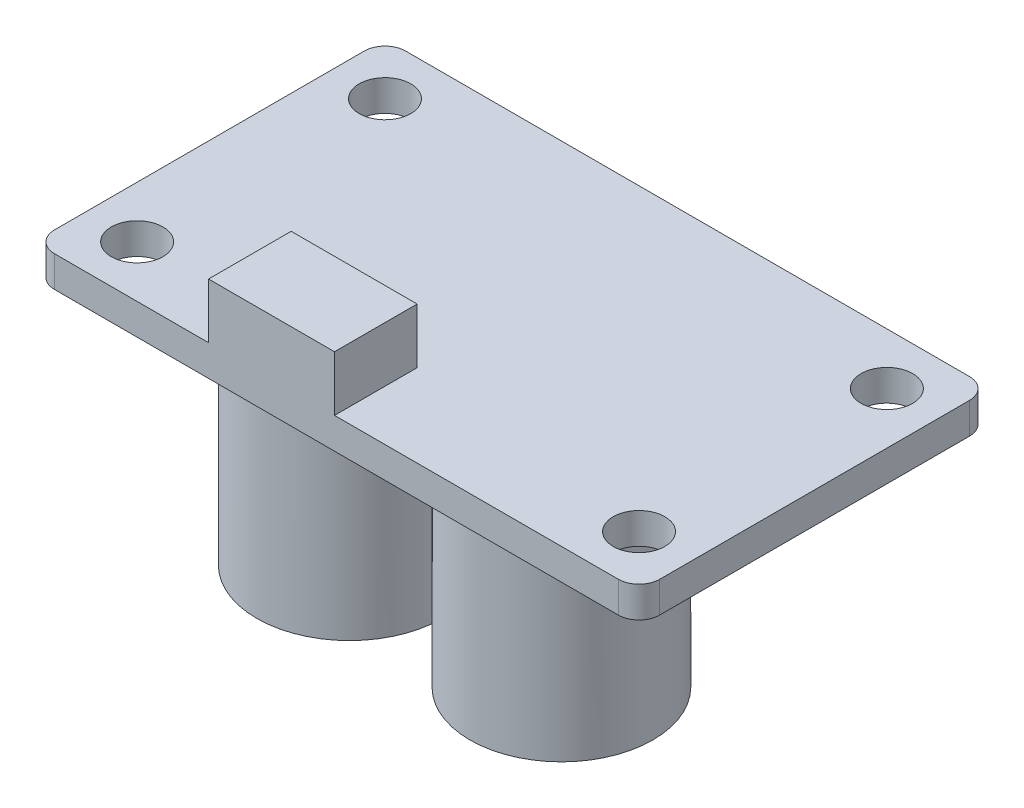
ISO-10303-21;
HEADER;
FILE_DESCRIPTION(('STEP AP214'),'2;1');
FILE_NAME('part.step','',(''),(''),'','','');
FILE_SCHEMA(('AUTOMOTIVE_DESIGN { 1 0 10303 214 1 1 1 1 }'));
ENDSEC;
DATA;
#1=APPLICATION_CONTEXT('core data for automotive mechanical design processes');
#2=APPLICATION_PROTOCOL_DEFINITION('international standard','automotive_design',2000,#1);
#3=PRODUCT_CONTEXT('',#1,'mechanical');
#4=PRODUCT('Part','Part','',(#3));
#5=PRODUCT_RELATED_PRODUCT_CATEGORY('part','',(#4));
#6=PRODUCT_DEFINITION_FORMATION('','',#4);
#7=PRODUCT_DEFINITION_CONTEXT('part definition',#1,'design');
#8=PRODUCT_DEFINITION('design','',#6,#7);
#9=PRODUCT_DEFINITION_SHAPE('','',#8);
#10=(LENGTH_UNIT() NAMED_UNIT(*) SI_UNIT(.MILLI.,.METRE.));
#11=(NAMED_UNIT(*) PLANE_ANGLE_UNIT() SI_UNIT($,.RADIAN.));
#12=(NAMED_UNIT(*) SI_UNIT($,.STERADIAN.) SOLID_ANGLE_UNIT());
#13=UNCERTAINTY_MEASURE_WITH_UNIT(LENGTH_MEASURE(1.E-05),#10,'distance_accuracy_value','');
#14=(GEOMETRIC_REPRESENTATION_CONTEXT(3) GLOBAL_UNCERTAINTY_ASSIGNED_CONTEXT((#13)) GLOBAL_UNIT_ASSIGNED_CONTEXT((#10,
#11,#12)) REPRESENTATION_CONTEXT('',''));
#15=CARTESIAN_POINT('',(0.,0.,0.));
#16=DIRECTION('',(0.,0.,1.));
#17=DIRECTION('',(1.,0.,0.));
#18=AXIS2_PLACEMENT_3D('',#15,#16,#17);
#19=CARTESIAN_POINT('',(14.65,1.5,-8.5));
#20=DIRECTION('',(-1.,0.,0.));
#21=DIRECTION('',(0.,0.,1.));
#22=AXIS2_PLACEMENT_3D('',#19,#20,#21);
#23=PLANE('',#22);
#24=DIRECTION('',(0.,0.,-1.));
#25=VECTOR('',#24,1.);
#26=CARTESIAN_POINT('',(14.65,0.,-8.5));
#27=LINE('',#26,#25);
#28=CARTESIAN_POINT('',(14.65,0.,7.5));
#29=VERTEX_POINT('',#28);
#30=CARTESIAN_POINT('',(14.65,0.,-7.5));
#31=VERTEX_POINT('',#30);
#32=EDGE_CURVE('E185',#29,#31,#27,.T.);
#33=ORIENTED_EDGE('',*,*,#32,.T.);
#34=DIRECTION('',(0.,-1.,0.));
#35=VECTOR('',#34,1.);
#36=CARTESIAN_POINT('',(14.65,1.5,-7.5));
#37=LINE('',#36,#35);
#38=CARTESIAN_POINT('',(14.65,1.5,-7.5));
#39=VERTEX_POINT('',#38);
#40=EDGE_CURVE('E232',#31,#39,#37,.F.);
#41=ORIENTED_EDGE('',*,*,#40,.T.);
#42=DIRECTION('',(0.,0.,-1.));
#43=VECTOR('',#42,1.);
#44=CARTESIAN_POINT('',(14.65,1.5,-8.5));
#45=LINE('',#44,#43);
#46=CARTESIAN_POINT('',(14.65,1.5,7.5));
#47=VERTEX_POINT('',#46);
#48=EDGE_CURVE('E188',#47,#39,#45,.T.);
#49=ORIENTED_EDGE('',*,*,#48,.F.);
#50=DIRECTION('',(0.,-1.,0.));
#51=VECTOR('',#50,1.);
#52=CARTESIAN_POINT('',(14.65,1.5,7.5));
#53=LINE('',#52,#51);
#54=EDGE_CURVE('E229',#47,#29,#53,.T.);
#55=ORIENTED_EDGE('',*,*,#54,.T.);
#56=EDGE_LOOP('',(#33,#41,#49,#55));
#57=FACE_BOUND('',#56,.T.);
#58=ADVANCED_FACE('F39',(#57),#23,.F.);
#59=CARTESIAN_POINT('',(-14.65,1.5,-8.5));
#60=DIRECTION('',(0.,0.,1.));
#61=DIRECTION('',(1.,0.,0.));
#62=AXIS2_PLACEMENT_3D('',#59,#60,#61);
#63=PLANE('',#62);
#64=DIRECTION('',(-1.,0.,0.));
#65=VECTOR('',#64,1.);
#66=CARTESIAN_POINT('',(-14.65,1.5,-8.5));
#67=LINE('',#66,#65);
#68=CARTESIAN_POINT('',(13.65,1.5,-8.5));
#69=VERTEX_POINT('',#68);
#70=CARTESIAN_POINT('',(-13.65,1.5,-8.5));
#71=VERTEX_POINT('',#70);
#72=EDGE_CURVE('E190',#69,#71,#67,.T.);
#73=ORIENTED_EDGE('',*,*,#72,.F.);
#74=DIRECTION('',(0.,-1.,0.));
#75=VECTOR('',#74,1.);
#76=CARTESIAN_POINT('',(13.65,1.5,-8.5));
#77=LINE('',#76,#75);
#78=CARTESIAN_POINT('',(13.65,0.,-8.5));
#79=VERTEX_POINT('',#78);
#80=EDGE_CURVE('E218',#69,#79,#77,.T.);
#81=ORIENTED_EDGE('',*,*,#80,.T.);
#82=DIRECTION('',(-1.,0.,0.));
#83=VECTOR('',#82,1.);
#84=CARTESIAN_POINT('',(-14.65,0.,-8.5));
#85=LINE('',#84,#83);
#86=CARTESIAN_POINT('',(-13.65,0.,-8.5));
#87=VERTEX_POINT('',#86);
#88=EDGE_CURVE('E201',#79,#87,#85,.T.);
#89=ORIENTED_EDGE('',*,*,#88,.T.);
#90=DIRECTION('',(0.,-1.,0.));
#91=VECTOR('',#90,1.);
#92=CARTESIAN_POINT('',(-13.65,1.5,-8.5));
#93=LINE('',#92,#91);
#94=EDGE_CURVE('E216',#87,#71,#93,.F.);
#95=ORIENTED_EDGE('',*,*,#94,.T.);
#96=EDGE_LOOP('',(#73,#81,#89,#95));
#97=FACE_BOUND('',#96,.T.);
#98=ADVANCED_FACE('F267',(#97),#63,.F.);
#99=CARTESIAN_POINT('',(-14.65,1.5,-8.5));
#100=DIRECTION('',(1.,0.,0.));
#101=DIRECTION('',(0.,0.,-1.));
#102=AXIS2_PLACEMENT_3D('',#99,#100,#101);
#103=PLANE('',#102);
#104=DIRECTION('',(0.,0.,1.));
#105=VECTOR('',#104,1.);
#106=CARTESIAN_POINT('',(-14.65,1.5,-8.5));
#107=LINE('',#106,#105);
#108=CARTESIAN_POINT('',(-14.65,1.5,-7.5));
#109=VERTEX_POINT('',#108);
#110=CARTESIAN_POINT('',(-14.65,1.5,7.5));
#111=VERTEX_POINT('',#110);
#112=EDGE_CURVE('E194',#109,#111,#107,.T.);
#113=ORIENTED_EDGE('',*,*,#112,.F.);
#114=DIRECTION('',(0.,-1.,0.));
#115=VECTOR('',#114,1.);
#116=CARTESIAN_POINT('',(-14.65,1.5,-7.5));
#117=LINE('',#116,#115);
#118=CARTESIAN_POINT('',(-14.65,0.,-7.5));
#119=VERTEX_POINT('',#118);
#120=EDGE_CURVE('E242',#109,#119,#117,.T.);
#121=ORIENTED_EDGE('',*,*,#120,.T.);
#122=DIRECTION('',(0.,0.,1.));
#123=VECTOR('',#122,1.);
#124=CARTESIAN_POINT('',(-14.65,0.,-8.5));
#125=LINE('',#124,#123);
#126=CARTESIAN_POINT('',(-14.65,0.,7.5));
#127=VERTEX_POINT('',#126);
#128=EDGE_CURVE('E204',#119,#127,#125,.T.);
#129=ORIENTED_EDGE('',*,*,#128,.T.);
#130=DIRECTION('',(0.,-1.,0.));
#131=VECTOR('',#130,1.);
#132=CARTESIAN_POINT('',(-14.65,1.5,7.5));
#133=LINE('',#132,#131);
#134=EDGE_CURVE('E62',#127,#111,#133,.F.);
#135=ORIENTED_EDGE('',*,*,#134,.T.);
#136=EDGE_LOOP('',(#113,#121,#129,#135));
#137=FACE_BOUND('',#136,.T.);
#138=ADVANCED_FACE('F274',(#137),#103,.F.);
#139=CARTESIAN_POINT('',(-14.65,1.5,8.5));
#140=DIRECTION('',(0.,0.,-1.));
#141=DIRECTION('',(-1.,0.,0.));
#142=AXIS2_PLACEMENT_3D('',#139,#140,#141);
#143=PLANE('',#142);
#144=DIRECTION('',(1.,0.,0.));
#145=VECTOR('',#144,1.);
#146=CARTESIAN_POINT('',(-14.65,1.5,8.5));
#147=LINE('',#146,#145);
#148=CARTESIAN_POINT('',(-13.65,1.5,8.5));
#149=VERTEX_POINT('',#148);
#150=CARTESIAN_POINT('',(-6.19143721090154,1.5,8.5));
#151=VERTEX_POINT('',#150);
#152=EDGE_CURVE('E154',#149,#151,#147,.T.);
#153=ORIENTED_EDGE('',*,*,#152,.F.);
#154=DIRECTION('',(0.,-1.,0.));
#155=VECTOR('',#154,1.);
#156=CARTESIAN_POINT('',(-13.65,1.5,8.5));
#157=LINE('',#156,#155);
#158=CARTESIAN_POINT('',(-13.65,0.,8.5));
#159=VERTEX_POINT('',#158);
#160=EDGE_CURVE('E11',#149,#159,#157,.T.);
#161=ORIENTED_EDGE('',*,*,#160,.T.);
#162=DIRECTION('',(1.,0.,0.));
#163=VECTOR('',#162,1.);
#164=CARTESIAN_POINT('',(-14.65,0.,8.5));
#165=LINE('',#164,#163);
#166=CARTESIAN_POINT('',(13.65,0.,8.5));
#167=VERTEX_POINT('',#166);
#168=EDGE_CURVE('E191',#159,#167,#165,.T.);
#169=ORIENTED_EDGE('',*,*,#168,.T.);
#170=DIRECTION('',(0.,-1.,0.));
#171=VECTOR('',#170,1.);
#172=CARTESIAN_POINT('',(13.65,1.5,8.5));
#173=LINE('',#172,#171);
#174=CARTESIAN_POINT('',(13.65,1.5,8.5));
#175=VERTEX_POINT('',#174);
#176=EDGE_CURVE('E47',#167,#175,#173,.F.);
#177=ORIENTED_EDGE('',*,*,#176,.T.);
#178=CARTESIAN_POINT('',(-0.0929222289512352,1.5,8.5));
#179=VERTEX_POINT('',#178);
#180=EDGE_CURVE('E196',#179,#175,#147,.T.);
#181=ORIENTED_EDGE('',*,*,#180,.F.);
#182=DIRECTION('',(0.,1.,0.));
#183=VECTOR('',#182,1.);
#184=CARTESIAN_POINT('',(-0.0929222289512352,1.5,8.5));
#185=LINE('',#184,#183);
#186=CARTESIAN_POINT('',(-0.0929222289512352,4.17007272751846,8.5));
#187=VERTEX_POINT('',#186);
#188=EDGE_CURVE('E281',#179,#187,#185,.T.);
#189=ORIENTED_EDGE('',*,*,#188,.T.);
#190=DIRECTION('',(-1.,0.,0.));
#191=VECTOR('',#190,1.);
#192=CARTESIAN_POINT('',(-6.19143721090154,4.17007272751846,8.5));
#193=LINE('',#192,#191);
#194=CARTESIAN_POINT('',(-6.19143721090154,4.17007272751846,8.5));
#195=VERTEX_POINT('',#194);
#196=EDGE_CURVE('E149',#187,#195,#193,.T.);
#197=ORIENTED_EDGE('',*,*,#196,.T.);
#198=DIRECTION('',(0.,-1.,0.));
#199=VECTOR('',#198,1.);
#200=CARTESIAN_POINT('',(-6.19143721090154,1.5,8.5));
#201=LINE('',#200,#199);
#202=EDGE_CURVE('E279',#195,#151,#201,.T.);
#203=ORIENTED_EDGE('',*,*,#202,.T.);
#204=EDGE_LOOP('',(#153,#161,#169,#177,#181,#189,#197,#203));
#205=FACE_BOUND('',#204,.T.);
#206=ADVANCED_FACE('F248',(#205),#143,.F.);
#207=CARTESIAN_POINT('',(0.,1.5,0.));
#208=DIRECTION('',(0.,1.,0.));
#209=DIRECTION('',(0.,0.,1.));
#210=AXIS2_PLACEMENT_3D('',#207,#208,#209);
#211=PLANE('',#210);
#212=ORIENTED_EDGE('',*,*,#48,.T.);
#213=CARTESIAN_POINT('',(13.65,1.5,-7.5));
#214=DIRECTION('',(0.,1.,0.));
#215=DIRECTION('',(0.,0.,1.));
#216=AXIS2_PLACEMENT_3D('',#213,#214,#215);
#217=CIRCLE('',#216,1.);
#218=EDGE_CURVE('E239',#39,#69,#217,.T.);
#219=ORIENTED_EDGE('',*,*,#218,.T.);
#220=ORIENTED_EDGE('',*,*,#72,.T.);
#221=CARTESIAN_POINT('',(-13.65,1.5,-7.5));
#222=DIRECTION('',(0.,1.,0.));
#223=DIRECTION('',(0.,0.,1.));
#224=AXIS2_PLACEMENT_3D('',#221,#222,#223);
#225=CIRCLE('',#224,1.);
#226=EDGE_CURVE('E237',#71,#109,#225,.T.);
#227=ORIENTED_EDGE('',*,*,#226,.T.);
#228=ORIENTED_EDGE('',*,*,#112,.T.);
#229=CARTESIAN_POINT('',(-13.65,1.5,7.5));
#230=DIRECTION('',(0.,1.,0.));
#231=DIRECTION('',(0.,0.,1.));
#232=AXIS2_PLACEMENT_3D('',#229,#230,#231);
#233=CIRCLE('',#232,1.);
#234=EDGE_CURVE('E54',#111,#149,#233,.T.);
#235=ORIENTED_EDGE('',*,*,#234,.T.);
#236=ORIENTED_EDGE('',*,*,#152,.T.);
#237=DIRECTION('',(0.,0.,1.));
#238=VECTOR('',#237,1.);
#239=CARTESIAN_POINT('',(-6.19143721090154,1.5,4.5));
#240=LINE('',#239,#238);
#241=CARTESIAN_POINT('',(-6.19143721090154,1.5,4.5));
#242=VERTEX_POINT('',#241);
#243=EDGE_CURVE('E146',#242,#151,#240,.T.);
#244=ORIENTED_EDGE('',*,*,#243,.F.);
#245=DIRECTION('',(1.,0.,0.));
#246=VECTOR('',#245,1.);
#247=CARTESIAN_POINT('',(-6.19143721090154,1.5,4.5));
#248=LINE('',#247,#246);
#249=CARTESIAN_POINT('',(-0.0929222289512352,1.5,4.5));
#250=VERTEX_POINT('',#249);
#251=EDGE_CURVE('E131',#242,#250,#248,.T.);
#252=ORIENTED_EDGE('',*,*,#251,.T.);
#253=DIRECTION('',(0.,0.,1.));
#254=VECTOR('',#253,1.);
#255=CARTESIAN_POINT('',(-0.0929222289512352,1.5,4.5));
#256=LINE('',#255,#254);
#257=EDGE_CURVE('E155',#250,#179,#256,.T.);
#258=ORIENTED_EDGE('',*,*,#257,.T.);
#259=ORIENTED_EDGE('',*,*,#180,.T.);
#260=CARTESIAN_POINT('',(13.65,1.5,7.5));
#261=DIRECTION('',(0.,1.,0.));
#262=DIRECTION('',(0.,0.,1.));
#263=AXIS2_PLACEMENT_3D('',#260,#261,#262);
#264=CIRCLE('',#263,1.);
#265=EDGE_CURVE('E234',#175,#47,#264,.T.);
#266=ORIENTED_EDGE('',*,*,#265,.T.);
#267=EDGE_LOOP('',(#212,#219,#220,#227,#228,#235,#236,#244,#252,#258,#259,#266));
#268=FACE_BOUND('',#267,.T.);
#269=CARTESIAN_POINT('',(-12.15,1.5,6.));
#270=DIRECTION('',(0.,1.,0.));
#271=DIRECTION('',(0.,0.,-1.));
#272=AXIS2_PLACEMENT_3D('',#269,#270,#271);
#273=CIRCLE('',#272,1.25);
#274=CARTESIAN_POINT('',(-12.15,1.5,4.75));
#275=VERTEX_POINT('',#274);
#276=EDGE_CURVE('E176',#275,#275,#273,.T.);
#277=ORIENTED_EDGE('',*,*,#276,.F.);
#278=EDGE_LOOP('',(#277));
#279=FACE_BOUND('',#278,.T.);
#280=CARTESIAN_POINT('',(12.15,1.5,6.));
#281=DIRECTION('',(0.,1.,0.));
#282=DIRECTION('',(0.,0.,1.));
#283=AXIS2_PLACEMENT_3D('',#280,#281,#282);
#284=CIRCLE('',#283,1.25);
#285=CARTESIAN_POINT('',(12.15,1.5,7.25));
#286=VERTEX_POINT('',#285);
#287=EDGE_CURVE('E170',#286,#286,#284,.T.);
#288=ORIENTED_EDGE('',*,*,#287,.F.);
#289=EDGE_LOOP('',(#288));
#290=FACE_BOUND('',#289,.T.);
#291=CARTESIAN_POINT('',(12.15,1.5,-6.));
#292=DIRECTION('',(0.,1.,0.));
#293=DIRECTION('',(0.,0.,-1.));
#294=AXIS2_PLACEMENT_3D('',#291,#292,#293);
#295=CIRCLE('',#294,1.25);
#296=CARTESIAN_POINT('',(12.15,1.5,-7.25));
#297=VERTEX_POINT('',#296);
#298=EDGE_CURVE('E163',#297,#297,#295,.T.);
#299=ORIENTED_EDGE('',*,*,#298,.F.);
#300=EDGE_LOOP('',(#299));
#301=FACE_BOUND('',#300,.T.);
#302=CARTESIAN_POINT('',(-12.15,1.5,-6.));
#303=DIRECTION('',(0.,1.,0.));
#304=DIRECTION('',(0.,0.,1.));
#305=AXIS2_PLACEMENT_3D('',#302,#303,#304);
#306=CIRCLE('',#305,1.25);
#307=CARTESIAN_POINT('',(-12.15,1.5,-4.75));
#308=VERTEX_POINT('',#307);
#309=EDGE_CURVE('E166',#308,#308,#306,.T.);
#310=ORIENTED_EDGE('',*,*,#309,.F.);
#311=EDGE_LOOP('',(#310));
#312=FACE_BOUND('',#311,.T.);
#313=ADVANCED_FACE('F152',(#268,#279,#290,#301,#312),#211,.T.);
#314=CARTESIAN_POINT('',(0.,0.,0.));
#315=DIRECTION('',(0.,1.,0.));
#316=DIRECTION('',(0.,0.,1.));
#317=AXIS2_PLACEMENT_3D('',#314,#315,#316);
#318=PLANE('',#317);
#319=CARTESIAN_POINT('',(0.,0.,-5.44032770653012));
#320=DIRECTION('',(0.,1.,0.));
#321=DIRECTION('',(0.,0.,1.));
#322=AXIS2_PLACEMENT_3D('',#319,#320,#321);
#323=CIRCLE('',#322,2.74694608211412);
#324=CARTESIAN_POINT('',(0.,0.,-2.693381624416));
#325=VERTEX_POINT('',#324);
#326=EDGE_CURVE('E213',#325,#325,#323,.F.);
#327=ORIENTED_EDGE('',*,*,#326,.F.);
#328=EDGE_LOOP('',(#327));
#329=FACE_BOUND('',#328,.T.);
#330=CARTESIAN_POINT('',(5.29599279582271,0.,2.90385785140224));
#331=DIRECTION('',(0.,1.,0.));
#332=DIRECTION('',(0.,0.,1.));
#333=AXIS2_PLACEMENT_3D('',#330,#331,#332);
#334=CIRCLE('',#333,4.4292671972736);
#335=CARTESIAN_POINT('',(5.29599279582271,0.,7.33312504867584));
#336=VERTEX_POINT('',#335);
#337=EDGE_CURVE('E210',#336,#336,#334,.F.);
#338=ORIENTED_EDGE('',*,*,#337,.F.);
#339=EDGE_LOOP('',(#338));
#340=FACE_BOUND('',#339,.T.);
#341=CARTESIAN_POINT('',(-4.9618466089516,0.,2.90385785140224));
#342=DIRECTION('',(0.,1.,0.));
#343=DIRECTION('',(0.,0.,1.));
#344=AXIS2_PLACEMENT_3D('',#341,#342,#343);
#345=CIRCLE('',#344,4.4923382274328);
#346=CARTESIAN_POINT('',(-4.9618466089516,0.,7.39619607883504));
#347=VERTEX_POINT('',#346);
#348=EDGE_CURVE('E198',#347,#347,#345,.F.);
#349=ORIENTED_EDGE('',*,*,#348,.F.);
#350=EDGE_LOOP('',(#349));
#351=FACE_BOUND('',#350,.T.);
#352=CARTESIAN_POINT('',(-12.15,0.,6.));
#353=DIRECTION('',(0.,1.,0.));
#354=DIRECTION('',(0.,0.,-1.));
#355=AXIS2_PLACEMENT_3D('',#352,#353,#354);
#356=CIRCLE('',#355,1.25);
#357=CARTESIAN_POINT('',(-12.15,0.,4.75));
#358=VERTEX_POINT('',#357);
#359=EDGE_CURVE('E179',#358,#358,#356,.T.);
#360=ORIENTED_EDGE('',*,*,#359,.T.);
#361=EDGE_LOOP('',(#360));
#362=FACE_BOUND('',#361,.T.);
#363=CARTESIAN_POINT('',(12.15,0.,6.));
#364=DIRECTION('',(0.,1.,0.));
#365=DIRECTION('',(0.,0.,1.));
#366=AXIS2_PLACEMENT_3D('',#363,#364,#365);
#367=CIRCLE('',#366,1.25);
#368=CARTESIAN_POINT('',(12.15,0.,7.25));
#369=VERTEX_POINT('',#368);
#370=EDGE_CURVE('E173',#369,#369,#367,.T.);
#371=ORIENTED_EDGE('',*,*,#370,.T.);
#372=EDGE_LOOP('',(#371));
#373=FACE_BOUND('',#372,.T.);
#374=CARTESIAN_POINT('',(12.15,0.,-6.));
#375=DIRECTION('',(0.,1.,0.));
#376=DIRECTION('',(0.,0.,-1.));
#377=AXIS2_PLACEMENT_3D('',#374,#375,#376);
#378=CIRCLE('',#377,1.25);
#379=CARTESIAN_POINT('',(12.15,0.,-7.25));
#380=VERTEX_POINT('',#379);
#381=EDGE_CURVE('E167',#380,#380,#378,.T.);
#382=ORIENTED_EDGE('',*,*,#381,.T.);
#383=EDGE_LOOP('',(#382));
#384=FACE_BOUND('',#383,.T.);
#385=CARTESIAN_POINT('',(-12.15,0.,-6.));
#386=DIRECTION('',(0.,1.,0.));
#387=DIRECTION('',(0.,0.,1.));
#388=AXIS2_PLACEMENT_3D('',#385,#386,#387);
#389=CIRCLE('',#388,1.25);
#390=CARTESIAN_POINT('',(-12.15,0.,-4.75));
#391=VERTEX_POINT('',#390);
#392=EDGE_CURVE('E182',#391,#391,#389,.T.);
#393=ORIENTED_EDGE('',*,*,#392,.T.);
#394=EDGE_LOOP('',(#393));
#395=FACE_BOUND('',#394,.T.);
#396=ORIENTED_EDGE('',*,*,#88,.F.);
#397=CARTESIAN_POINT('',(13.65,0.,-7.5));
#398=DIRECTION('',(0.,1.,0.));
#399=DIRECTION('',(0.,0.,1.));
#400=AXIS2_PLACEMENT_3D('',#397,#398,#399);
#401=CIRCLE('',#400,1.);
#402=EDGE_CURVE('E227',#79,#31,#401,.F.);
#403=ORIENTED_EDGE('',*,*,#402,.T.);
#404=ORIENTED_EDGE('',*,*,#32,.F.);
#405=CARTESIAN_POINT('',(13.65,0.,7.5));
#406=DIRECTION('',(0.,1.,0.));
#407=DIRECTION('',(0.,0.,1.));
#408=AXIS2_PLACEMENT_3D('',#405,#406,#407);
#409=CIRCLE('',#408,1.);
#410=EDGE_CURVE('E221',#29,#167,#409,.F.);
#411=ORIENTED_EDGE('',*,*,#410,.T.);
#412=ORIENTED_EDGE('',*,*,#168,.F.);
#413=CARTESIAN_POINT('',(-13.65,0.,7.5));
#414=DIRECTION('',(0.,1.,0.));
#415=DIRECTION('',(0.,0.,1.));
#416=AXIS2_PLACEMENT_3D('',#413,#414,#415);
#417=CIRCLE('',#416,1.);
#418=EDGE_CURVE('E223',#159,#127,#417,.F.);
#419=ORIENTED_EDGE('',*,*,#418,.T.);
#420=ORIENTED_EDGE('',*,*,#128,.F.);
#421=CARTESIAN_POINT('',(-13.65,0.,-7.5));
#422=DIRECTION('',(0.,1.,0.));
#423=DIRECTION('',(0.,0.,1.));
#424=AXIS2_PLACEMENT_3D('',#421,#422,#423);
#425=CIRCLE('',#424,1.);
#426=EDGE_CURVE('E225',#119,#87,#425,.F.);
#427=ORIENTED_EDGE('',*,*,#426,.T.);
#428=EDGE_LOOP('',(#396,#403,#404,#411,#412,#419,#420,#427));
#429=FACE_BOUND('',#428,.T.);
#430=ADVANCED_FACE('F260',(#329,#340,#351,#362,#373,#384,#395,#429),#318,.F.);
#431=CARTESIAN_POINT('',(-12.15,0.,-6.));
#432=DIRECTION('',(0.,1.,0.));
#433=DIRECTION('',(0.,0.,1.));
#434=AXIS2_PLACEMENT_3D('',#431,#432,#433);
#435=CYLINDRICAL_SURFACE('',#434,1.25);
#436=ORIENTED_EDGE('',*,*,#392,.F.);
#437=EDGE_LOOP('',(#436));
#438=FACE_BOUND('',#437,.T.);
#439=ORIENTED_EDGE('',*,*,#309,.T.);
#440=EDGE_LOOP('',(#439));
#441=FACE_BOUND('',#440,.T.);
#442=ADVANCED_FACE('F466',(#438,#441),#435,.F.);
#443=CARTESIAN_POINT('',(12.15,0.,-6.));
#444=DIRECTION('',(0.,1.,0.));
#445=DIRECTION('',(0.,0.,1.));
#446=AXIS2_PLACEMENT_3D('',#443,#444,#445);
#447=CYLINDRICAL_SURFACE('',#446,1.25);
#448=ORIENTED_EDGE('',*,*,#381,.F.);
#449=EDGE_LOOP('',(#448));
#450=FACE_BOUND('',#449,.T.);
#451=ORIENTED_EDGE('',*,*,#298,.T.);
#452=EDGE_LOOP('',(#451));
#453=FACE_BOUND('',#452,.T.);
#454=ADVANCED_FACE('F456',(#450,#453),#447,.F.);
#455=CARTESIAN_POINT('',(12.15,0.,6.));
#456=DIRECTION('',(0.,1.,0.));
#457=DIRECTION('',(0.,0.,1.));
#458=AXIS2_PLACEMENT_3D('',#455,#456,#457);
#459=CYLINDRICAL_SURFACE('',#458,1.25);
#460=ORIENTED_EDGE('',*,*,#370,.F.);
#461=EDGE_LOOP('',(#460));
#462=FACE_BOUND('',#461,.T.);
#463=ORIENTED_EDGE('',*,*,#287,.T.);
#464=EDGE_LOOP('',(#463));
#465=FACE_BOUND('',#464,.T.);
#466=ADVANCED_FACE('F446',(#462,#465),#459,.F.);
#467=CARTESIAN_POINT('',(-12.15,0.,6.));
#468=DIRECTION('',(0.,1.,0.));
#469=DIRECTION('',(0.,0.,1.));
#470=AXIS2_PLACEMENT_3D('',#467,#468,#469);
#471=CYLINDRICAL_SURFACE('',#470,1.25);
#472=ORIENTED_EDGE('',*,*,#359,.F.);
#473=EDGE_LOOP('',(#472));
#474=FACE_BOUND('',#473,.T.);
#475=ORIENTED_EDGE('',*,*,#276,.T.);
#476=EDGE_LOOP('',(#475));
#477=FACE_BOUND('',#476,.T.);
#478=ADVANCED_FACE('F302',(#474,#477),#471,.F.);
#479=CARTESIAN_POINT('',(-6.19143721090154,1.5,4.5));
#480=DIRECTION('',(-1.,0.,0.));
#481=DIRECTION('',(0.,0.,1.));
#482=AXIS2_PLACEMENT_3D('',#479,#480,#481);
#483=PLANE('',#482);
#484=ORIENTED_EDGE('',*,*,#202,.F.);
#485=DIRECTION('',(0.,0.,1.));
#486=VECTOR('',#485,1.);
#487=CARTESIAN_POINT('',(-6.19143721090154,4.17007272751846,4.5));
#488=LINE('',#487,#486);
#489=CARTESIAN_POINT('',(-6.19143721090154,4.17007272751846,4.5));
#490=VERTEX_POINT('',#489);
#491=EDGE_CURVE('E148',#490,#195,#488,.T.);
#492=ORIENTED_EDGE('',*,*,#491,.F.);
#493=DIRECTION('',(0.,-1.,0.));
#494=VECTOR('',#493,1.);
#495=CARTESIAN_POINT('',(-6.19143721090154,1.5,4.5));
#496=LINE('',#495,#494);
#497=EDGE_CURVE('E135',#490,#242,#496,.T.);
#498=ORIENTED_EDGE('',*,*,#497,.T.);
#499=ORIENTED_EDGE('',*,*,#243,.T.);
#500=EDGE_LOOP('',(#484,#492,#498,#499));
#501=FACE_BOUND('',#500,.T.);
#502=ADVANCED_FACE('F145',(#501),#483,.T.);
#503=CARTESIAN_POINT('',(-6.19143721090154,4.17007272751846,4.5));
#504=DIRECTION('',(0.,1.,0.));
#505=DIRECTION('',(0.,0.,1.));
#506=AXIS2_PLACEMENT_3D('',#503,#504,#505);
#507=PLANE('',#506);
#508=ORIENTED_EDGE('',*,*,#196,.F.);
#509=DIRECTION('',(0.,0.,1.));
#510=VECTOR('',#509,1.);
#511=CARTESIAN_POINT('',(-0.0929222289512352,4.17007272751846,4.5));
#512=LINE('',#511,#510);
#513=CARTESIAN_POINT('',(-0.0929222289512352,4.17007272751846,4.5));
#514=VERTEX_POINT('',#513);
#515=EDGE_CURVE('E158',#514,#187,#512,.T.);
#516=ORIENTED_EDGE('',*,*,#515,.F.);
#517=DIRECTION('',(-1.,0.,0.));
#518=VECTOR('',#517,1.);
#519=CARTESIAN_POINT('',(-6.19143721090154,4.17007272751846,4.5));
#520=LINE('',#519,#518);
#521=EDGE_CURVE('E156',#514,#490,#520,.T.);
#522=ORIENTED_EDGE('',*,*,#521,.T.);
#523=ORIENTED_EDGE('',*,*,#491,.T.);
#524=EDGE_LOOP('',(#508,#516,#522,#523));
#525=FACE_BOUND('',#524,.T.);
#526=ADVANCED_FACE('F294',(#525),#507,.T.);
#527=CARTESIAN_POINT('',(-0.0929222289512352,1.5,4.5));
#528=DIRECTION('',(1.,0.,0.));
#529=DIRECTION('',(0.,0.,-1.));
#530=AXIS2_PLACEMENT_3D('',#527,#528,#529);
#531=PLANE('',#530);
#532=ORIENTED_EDGE('',*,*,#188,.F.);
#533=ORIENTED_EDGE('',*,*,#257,.F.);
#534=DIRECTION('',(0.,1.,0.));
#535=VECTOR('',#534,1.);
#536=CARTESIAN_POINT('',(-0.0929222289512352,1.5,4.5));
#537=LINE('',#536,#535);
#538=EDGE_CURVE('E138',#250,#514,#537,.T.);
#539=ORIENTED_EDGE('',*,*,#538,.T.);
#540=ORIENTED_EDGE('',*,*,#515,.T.);
#541=EDGE_LOOP('',(#532,#533,#539,#540));
#542=FACE_BOUND('',#541,.T.);
#543=ADVANCED_FACE('F292',(#542),#531,.T.);
#544=CARTESIAN_POINT('',(0.,0.,4.5));
#545=DIRECTION('',(0.,0.,-1.));
#546=DIRECTION('',(-1.,0.,0.));
#547=AXIS2_PLACEMENT_3D('',#544,#545,#546);
#548=PLANE('',#547);
#549=ORIENTED_EDGE('',*,*,#497,.F.);
#550=ORIENTED_EDGE('',*,*,#521,.F.);
#551=ORIENTED_EDGE('',*,*,#538,.F.);
#552=ORIENTED_EDGE('',*,*,#251,.F.);
#553=EDGE_LOOP('',(#549,#550,#551,#552));
#554=FACE_BOUND('',#553,.T.);
#555=ADVANCED_FACE('F133',(#554),#548,.T.);
#556=CARTESIAN_POINT('',(-4.9618466089516,-10.,2.90385785140224));
#557=DIRECTION('',(0.,1.,0.));
#558=DIRECTION('',(0.,0.,1.));
#559=AXIS2_PLACEMENT_3D('',#556,#557,#558);
#560=CYLINDRICAL_SURFACE('',#559,4.4923382274328);
#561=CARTESIAN_POINT('',(-4.9618466089516,-10.,2.90385785140224));
#562=DIRECTION('',(0.,-1.,0.));
#563=DIRECTION('',(0.,0.,-1.));
#564=AXIS2_PLACEMENT_3D('',#561,#562,#563);
#565=CIRCLE('',#564,4.4923382274328);
#566=CARTESIAN_POINT('',(-4.9618466089516,-10.,-1.58848037603057));
#567=VERTEX_POINT('',#566);
#568=EDGE_CURVE('E282',#567,#567,#565,.T.);
#569=ORIENTED_EDGE('',*,*,#568,.F.);
#570=EDGE_LOOP('',(#569));
#571=FACE_BOUND('',#570,.T.);
#572=ORIENTED_EDGE('',*,*,#348,.T.);
#573=EDGE_LOOP('',(#572));
#574=FACE_BOUND('',#573,.T.);
#575=ADVANCED_FACE('F390',(#571,#574),#560,.T.);
#576=CARTESIAN_POINT('',(-4.9618466089516,-10.,2.90385785140224));
#577=DIRECTION('',(0.,-1.,0.));
#578=DIRECTION('',(0.,0.,-1.));
#579=AXIS2_PLACEMENT_3D('',#576,#577,#578);
#580=PLANE('',#579);
#581=ORIENTED_EDGE('',*,*,#568,.T.);
#582=EDGE_LOOP('',(#581));
#583=FACE_BOUND('',#582,.T.);
#584=ADVANCED_FACE('F380',(#583),#580,.T.);
#585=CARTESIAN_POINT('',(5.29599279582271,-10.,2.90385785140224));
#586=DIRECTION('',(0.,1.,0.));
#587=DIRECTION('',(0.,0.,1.));
#588=AXIS2_PLACEMENT_3D('',#585,#586,#587);
#589=CYLINDRICAL_SURFACE('',#588,4.4292671972736);
#590=CARTESIAN_POINT('',(5.29599279582271,-10.,2.90385785140224));
#591=DIRECTION('',(0.,-1.,0.));
#592=DIRECTION('',(0.,0.,-1.));
#593=AXIS2_PLACEMENT_3D('',#590,#591,#592);
#594=CIRCLE('',#593,4.4292671972736);
#595=CARTESIAN_POINT('',(5.29599279582271,-10.,-1.52540934587136));
#596=VERTEX_POINT('',#595);
#597=EDGE_CURVE('E286',#596,#596,#594,.T.);
#598=ORIENTED_EDGE('',*,*,#597,.F.);
#599=EDGE_LOOP('',(#598));
#600=FACE_BOUND('',#599,.T.);
#601=ORIENTED_EDGE('',*,*,#337,.T.);
#602=EDGE_LOOP('',(#601));
#603=FACE_BOUND('',#602,.T.);
#604=ADVANCED_FACE('F370',(#600,#603),#589,.T.);
#605=CARTESIAN_POINT('',(5.29599279582271,-10.,2.90385785140224));
#606=DIRECTION('',(0.,-1.,0.));
#607=DIRECTION('',(0.,0.,-1.));
#608=AXIS2_PLACEMENT_3D('',#605,#606,#607);
#609=PLANE('',#608);
#610=ORIENTED_EDGE('',*,*,#597,.T.);
#611=EDGE_LOOP('',(#610));
#612=FACE_BOUND('',#611,.T.);
#613=ADVANCED_FACE('F360',(#612),#609,.T.);
#614=CARTESIAN_POINT('',(0.,-2.,-5.44032770653012));
#615=DIRECTION('',(0.,1.,0.));
#616=DIRECTION('',(0.,0.,1.));
#617=AXIS2_PLACEMENT_3D('',#614,#615,#616);
#618=CYLINDRICAL_SURFACE('',#617,2.74694608211412);
#619=CARTESIAN_POINT('',(0.,-2.,-5.44032770653012));
#620=DIRECTION('',(0.,-1.,0.));
#621=DIRECTION('',(0.,0.,-1.));
#622=AXIS2_PLACEMENT_3D('',#619,#620,#621);
#623=CIRCLE('',#622,2.74694608211412);
#624=CARTESIAN_POINT('',(0.,-2.,-8.18727378864423));
#625=VERTEX_POINT('',#624);
#626=EDGE_CURVE('E539',#625,#625,#623,.T.);
#627=ORIENTED_EDGE('',*,*,#626,.F.);
#628=EDGE_LOOP('',(#627));
#629=FACE_BOUND('',#628,.T.);
#630=ORIENTED_EDGE('',*,*,#326,.T.);
#631=EDGE_LOOP('',(#630));
#632=FACE_BOUND('',#631,.T.);
#633=ADVANCED_FACE('F350',(#629,#632),#618,.T.);
#634=CARTESIAN_POINT('',(0.,-2.,-5.44032770653012));
#635=DIRECTION('',(0.,-1.,0.));
#636=DIRECTION('',(0.,0.,-1.));
#637=AXIS2_PLACEMENT_3D('',#634,#635,#636);
#638=PLANE('',#637);
#639=ORIENTED_EDGE('',*,*,#626,.T.);
#640=EDGE_LOOP('',(#639));
#641=FACE_BOUND('',#640,.T.);
#642=ADVANCED_FACE('F316',(#641),#638,.T.);
#643=CARTESIAN_POINT('',(13.65,1.5,-7.5));
#644=DIRECTION('',(0.,-1.,0.));
#645=DIRECTION('',(0.,0.,-1.));
#646=AXIS2_PLACEMENT_3D('',#643,#644,#645);
#647=CYLINDRICAL_SURFACE('',#646,1.);
#648=ORIENTED_EDGE('',*,*,#218,.F.);
#649=ORIENTED_EDGE('',*,*,#40,.F.);
#650=ORIENTED_EDGE('',*,*,#402,.F.);
#651=ORIENTED_EDGE('',*,*,#80,.F.);
#652=EDGE_LOOP('',(#648,#649,#650,#651));
#653=FACE_BOUND('',#652,.T.);
#654=ADVANCED_FACE('F264',(#653),#647,.T.);
#655=CARTESIAN_POINT('',(-13.65,1.5,-7.5));
#656=DIRECTION('',(0.,-1.,0.));
#657=DIRECTION('',(0.,0.,-1.));
#658=AXIS2_PLACEMENT_3D('',#655,#656,#657);
#659=CYLINDRICAL_SURFACE('',#658,1.);
#660=ORIENTED_EDGE('',*,*,#226,.F.);
#661=ORIENTED_EDGE('',*,*,#94,.F.);
#662=ORIENTED_EDGE('',*,*,#426,.F.);
#663=ORIENTED_EDGE('',*,*,#120,.F.);
#664=EDGE_LOOP('',(#660,#661,#662,#663));
#665=FACE_BOUND('',#664,.T.);
#666=ADVANCED_FACE('F272',(#665),#659,.T.);
#667=CARTESIAN_POINT('',(-13.65,1.5,7.5));
#668=DIRECTION('',(0.,-1.,0.));
#669=DIRECTION('',(0.,0.,-1.));
#670=AXIS2_PLACEMENT_3D('',#667,#668,#669);
#671=CYLINDRICAL_SURFACE('',#670,1.);
#672=ORIENTED_EDGE('',*,*,#234,.F.);
#673=ORIENTED_EDGE('',*,*,#134,.F.);
#674=ORIENTED_EDGE('',*,*,#418,.F.);
#675=ORIENTED_EDGE('',*,*,#160,.F.);
#676=EDGE_LOOP('',(#672,#673,#674,#675));
#677=FACE_BOUND('',#676,.T.);
#678=ADVANCED_FACE('F277',(#677),#671,.T.);
#679=CARTESIAN_POINT('',(13.65,1.5,7.5));
#680=DIRECTION('',(0.,-1.,0.));
#681=DIRECTION('',(0.,0.,-1.));
#682=AXIS2_PLACEMENT_3D('',#679,#680,#681);
#683=CYLINDRICAL_SURFACE('',#682,1.);
#684=ORIENTED_EDGE('',*,*,#265,.F.);
#685=ORIENTED_EDGE('',*,*,#176,.F.);
#686=ORIENTED_EDGE('',*,*,#410,.F.);
#687=ORIENTED_EDGE('',*,*,#54,.F.);
#688=EDGE_LOOP('',(#684,#685,#686,#687));
#689=FACE_BOUND('',#688,.T.);
#690=ADVANCED_FACE('F41',(#689),#683,.T.);
#691=CLOSED_SHELL('',(#58,#98,#138,#206,#313,#430,#442,#454,#466,#478,#502,#526,#543,#555,#575,
#584,#604,#613,#633,#642,#654,#666,#678,#690));
#692=MANIFOLD_SOLID_BREP('B2',#691);
#693=ADVANCED_BREP_SHAPE_REPRESENTATION('',(#18,#692),#14);
#694=SHAPE_DEFINITION_REPRESENTATION(#9,#693);
ENDSEC;
END-ISO-10303-21;
